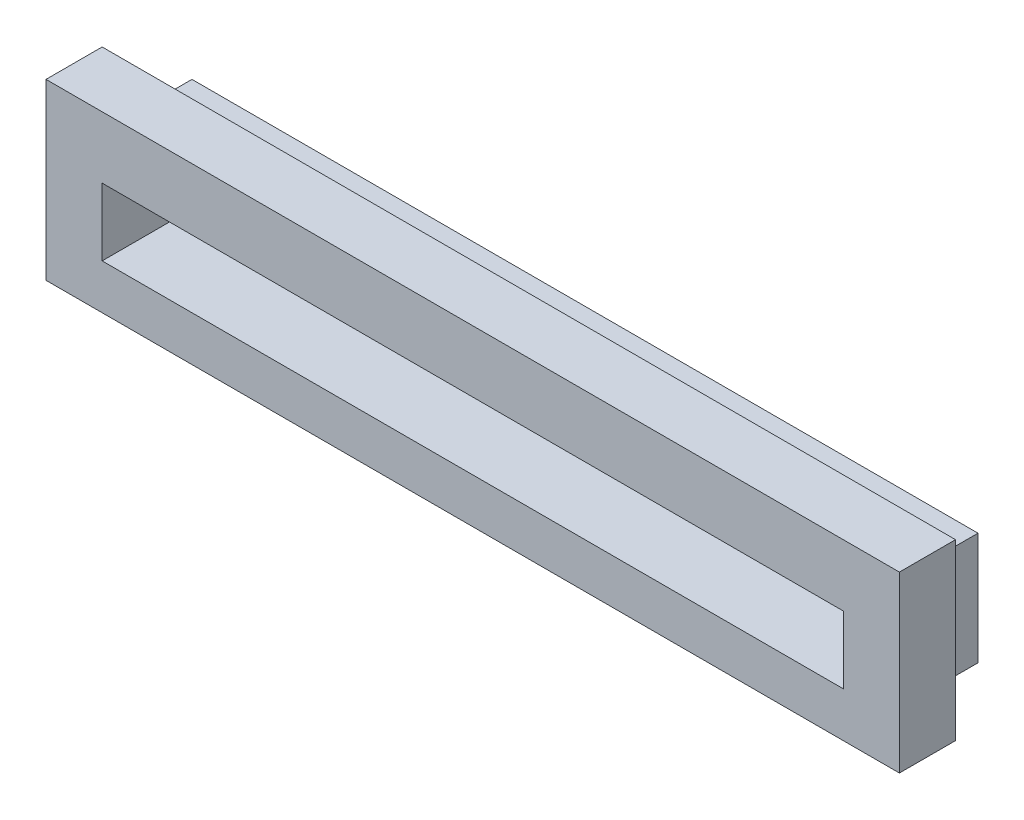
ISO-10303-21;
HEADER;
FILE_DESCRIPTION(('STEP AP214'),'2;1');
FILE_NAME('part.step','',(''),(''),'','','');
FILE_SCHEMA(('AUTOMOTIVE_DESIGN { 1 0 10303 214 1 1 1 1 }'));
ENDSEC;
DATA;
#1=APPLICATION_CONTEXT('core data for automotive mechanical design processes');
#2=APPLICATION_PROTOCOL_DEFINITION('international standard','automotive_design',2000,#1);
#3=PRODUCT_CONTEXT('',#1,'mechanical');
#4=PRODUCT('Part','Part','',(#3));
#5=PRODUCT_RELATED_PRODUCT_CATEGORY('part','',(#4));
#6=PRODUCT_DEFINITION_FORMATION('','',#4);
#7=PRODUCT_DEFINITION_CONTEXT('part definition',#1,'design');
#8=PRODUCT_DEFINITION('design','',#6,#7);
#9=PRODUCT_DEFINITION_SHAPE('','',#8);
#10=(LENGTH_UNIT() NAMED_UNIT(*) SI_UNIT(.MILLI.,.METRE.));
#11=(NAMED_UNIT(*) PLANE_ANGLE_UNIT() SI_UNIT($,.RADIAN.));
#12=(NAMED_UNIT(*) SI_UNIT($,.STERADIAN.) SOLID_ANGLE_UNIT());
#13=UNCERTAINTY_MEASURE_WITH_UNIT(LENGTH_MEASURE(1.E-05),#10,'distance_accuracy_value','');
#14=(GEOMETRIC_REPRESENTATION_CONTEXT(3) GLOBAL_UNCERTAINTY_ASSIGNED_CONTEXT((#13)) GLOBAL_UNIT_ASSIGNED_CONTEXT((#10,
#11,#12)) REPRESENTATION_CONTEXT('',''));
#15=CARTESIAN_POINT('',(0.,0.,0.));
#16=DIRECTION('',(0.,0.,1.));
#17=DIRECTION('',(1.,0.,0.));
#18=AXIS2_PLACEMENT_3D('',#15,#16,#17);
#19=CARTESIAN_POINT('',(0.,0.,25.4));
#20=DIRECTION('',(1.,0.,0.));
#21=DIRECTION('',(0.,0.,-1.));
#22=AXIS2_PLACEMENT_3D('',#19,#20,#21);
#23=PLANE('',#22);
#24=DIRECTION('',(0.,-1.,0.));
#25=VECTOR('',#24,1.);
#26=CARTESIAN_POINT('',(0.,25.4,12.7));
#27=LINE('',#26,#25);
#28=CARTESIAN_POINT('',(0.,25.4,12.7));
#29=VERTEX_POINT('',#28);
#30=CARTESIAN_POINT('',(0.,0.,12.7));
#31=VERTEX_POINT('',#30);
#32=EDGE_CURVE('E149',#29,#31,#27,.T.);
#33=ORIENTED_EDGE('',*,*,#32,.F.);
#34=DIRECTION('',(0.,0.,-1.));
#35=VECTOR('',#34,1.);
#36=CARTESIAN_POINT('',(0.,25.4,25.4));
#37=LINE('',#36,#35);
#38=CARTESIAN_POINT('',(0.,25.4,0.));
#39=VERTEX_POINT('',#38);
#40=EDGE_CURVE('E135',#29,#39,#37,.T.);
#41=ORIENTED_EDGE('',*,*,#40,.T.);
#42=DIRECTION('',(0.,-1.,0.));
#43=VECTOR('',#42,1.);
#44=CARTESIAN_POINT('',(0.,0.,0.));
#45=LINE('',#44,#43);
#46=CARTESIAN_POINT('',(0.,0.,0.));
#47=VERTEX_POINT('',#46);
#48=EDGE_CURVE('E248',#39,#47,#45,.T.);
#49=ORIENTED_EDGE('',*,*,#48,.T.);
#50=DIRECTION('',(0.,0.,-1.));
#51=VECTOR('',#50,1.);
#52=CARTESIAN_POINT('',(0.,0.,25.4));
#53=LINE('',#52,#51);
#54=EDGE_CURVE('E11',#31,#47,#53,.T.);
#55=ORIENTED_EDGE('',*,*,#54,.F.);
#56=EDGE_LOOP('',(#33,#41,#49,#55));
#57=FACE_BOUND('',#56,.T.);
#58=ADVANCED_FACE('F47',(#57),#23,.F.);
#59=CARTESIAN_POINT('',(0.,0.,25.4));
#60=DIRECTION('',(0.,1.,0.));
#61=DIRECTION('',(0.,0.,1.));
#62=AXIS2_PLACEMENT_3D('',#59,#60,#61);
#63=PLANE('',#62);
#64=DIRECTION('',(1.,0.,0.));
#65=VECTOR('',#64,1.);
#66=CARTESIAN_POINT('',(0.,0.,12.7));
#67=LINE('',#66,#65);
#68=CARTESIAN_POINT('',(177.8,0.,12.7));
#69=VERTEX_POINT('',#68);
#70=EDGE_CURVE('E61',#31,#69,#67,.T.);
#71=ORIENTED_EDGE('',*,*,#70,.F.);
#72=ORIENTED_EDGE('',*,*,#54,.T.);
#73=DIRECTION('',(1.,0.,0.));
#74=VECTOR('',#73,1.);
#75=CARTESIAN_POINT('',(0.,0.,0.));
#76=LINE('',#75,#74);
#77=CARTESIAN_POINT('',(177.8,0.,0.));
#78=VERTEX_POINT('',#77);
#79=EDGE_CURVE('E251',#47,#78,#76,.T.);
#80=ORIENTED_EDGE('',*,*,#79,.T.);
#81=DIRECTION('',(0.,0.,-1.));
#82=VECTOR('',#81,1.);
#83=CARTESIAN_POINT('',(177.8,0.,25.4));
#84=LINE('',#83,#82);
#85=EDGE_CURVE('E55',#69,#78,#84,.T.);
#86=ORIENTED_EDGE('',*,*,#85,.F.);
#87=EDGE_LOOP('',(#71,#72,#80,#86));
#88=FACE_BOUND('',#87,.T.);
#89=ADVANCED_FACE('F266',(#88),#63,.F.);
#90=CARTESIAN_POINT('',(177.8,0.,25.4));
#91=DIRECTION('',(-1.,0.,0.));
#92=DIRECTION('',(0.,0.,1.));
#93=AXIS2_PLACEMENT_3D('',#90,#91,#92);
#94=PLANE('',#93);
#95=DIRECTION('',(0.,1.,0.));
#96=VECTOR('',#95,1.);
#97=CARTESIAN_POINT('',(177.8,25.4,12.7));
#98=LINE('',#97,#96);
#99=CARTESIAN_POINT('',(177.8,25.4,12.7));
#100=VERTEX_POINT('',#99);
#101=EDGE_CURVE('E69',#69,#100,#98,.T.);
#102=ORIENTED_EDGE('',*,*,#101,.F.);
#103=ORIENTED_EDGE('',*,*,#85,.T.);
#104=DIRECTION('',(0.,1.,0.));
#105=VECTOR('',#104,1.);
#106=CARTESIAN_POINT('',(177.8,0.,0.));
#107=LINE('',#106,#105);
#108=CARTESIAN_POINT('',(177.8,25.4,0.));
#109=VERTEX_POINT('',#108);
#110=EDGE_CURVE('E255',#78,#109,#107,.T.);
#111=ORIENTED_EDGE('',*,*,#110,.T.);
#112=DIRECTION('',(0.,0.,-1.));
#113=VECTOR('',#112,1.);
#114=CARTESIAN_POINT('',(177.8,25.4,25.4));
#115=LINE('',#114,#113);
#116=EDGE_CURVE('E146',#100,#109,#115,.T.);
#117=ORIENTED_EDGE('',*,*,#116,.F.);
#118=EDGE_LOOP('',(#102,#103,#111,#117));
#119=FACE_BOUND('',#118,.T.);
#120=ADVANCED_FACE('F263',(#119),#94,.F.);
#121=CARTESIAN_POINT('',(0.,25.4,25.4));
#122=DIRECTION('',(0.,-1.,0.));
#123=DIRECTION('',(0.,0.,-1.));
#124=AXIS2_PLACEMENT_3D('',#121,#122,#123);
#125=PLANE('',#124);
#126=DIRECTION('',(-1.,0.,0.));
#127=VECTOR('',#126,1.);
#128=CARTESIAN_POINT('',(0.,25.4,12.7));
#129=LINE('',#128,#127);
#130=EDGE_CURVE('E139',#100,#29,#129,.T.);
#131=ORIENTED_EDGE('',*,*,#130,.F.);
#132=ORIENTED_EDGE('',*,*,#116,.T.);
#133=DIRECTION('',(-1.,0.,0.));
#134=VECTOR('',#133,1.);
#135=CARTESIAN_POINT('',(0.,25.4,0.));
#136=LINE('',#135,#134);
#137=EDGE_CURVE('E141',#109,#39,#136,.T.);
#138=ORIENTED_EDGE('',*,*,#137,.T.);
#139=ORIENTED_EDGE('',*,*,#40,.F.);
#140=EDGE_LOOP('',(#131,#132,#138,#139));
#141=FACE_BOUND('',#140,.T.);
#142=ADVANCED_FACE('F137',(#141),#125,.F.);
#143=CARTESIAN_POINT('',(0.,0.,25.4));
#144=DIRECTION('',(0.,0.,-1.));
#145=DIRECTION('',(-1.,0.,0.));
#146=AXIS2_PLACEMENT_3D('',#143,#144,#145);
#147=PLANE('',#146);
#148=DIRECTION('',(0.,-1.,0.));
#149=VECTOR('',#148,1.);
#150=CARTESIAN_POINT('',(5.08,20.32,25.4));
#151=LINE('',#150,#149);
#152=CARTESIAN_POINT('',(5.08,20.32,25.4));
#153=VERTEX_POINT('',#152);
#154=CARTESIAN_POINT('',(5.08,5.08,25.4));
#155=VERTEX_POINT('',#154);
#156=EDGE_CURVE('E206',#153,#155,#151,.T.);
#157=ORIENTED_EDGE('',*,*,#156,.F.);
#158=DIRECTION('',(-1.,0.,0.));
#159=VECTOR('',#158,1.);
#160=CARTESIAN_POINT('',(5.08,20.32,25.4));
#161=LINE('',#160,#159);
#162=CARTESIAN_POINT('',(172.72,20.32,25.4));
#163=VERTEX_POINT('',#162);
#164=EDGE_CURVE('E217',#163,#153,#161,.T.);
#165=ORIENTED_EDGE('',*,*,#164,.F.);
#166=DIRECTION('',(0.,1.,0.));
#167=VECTOR('',#166,1.);
#168=CARTESIAN_POINT('',(172.72,20.32,25.4));
#169=LINE('',#168,#167);
#170=CARTESIAN_POINT('',(172.72,5.08,25.4));
#171=VERTEX_POINT('',#170);
#172=EDGE_CURVE('E213',#171,#163,#169,.T.);
#173=ORIENTED_EDGE('',*,*,#172,.F.);
#174=DIRECTION('',(1.,0.,0.));
#175=VECTOR('',#174,1.);
#176=CARTESIAN_POINT('',(5.08,5.08,25.4));
#177=LINE('',#176,#175);
#178=EDGE_CURVE('E209',#155,#171,#177,.T.);
#179=ORIENTED_EDGE('',*,*,#178,.F.);
#180=EDGE_LOOP('',(#157,#165,#173,#179));
#181=FACE_BOUND('',#180,.T.);
#182=DIRECTION('',(0.,-1.,0.));
#183=VECTOR('',#182,1.);
#184=CARTESIAN_POINT('',(-7.62,34.29,25.4));
#185=LINE('',#184,#183);
#186=CARTESIAN_POINT('',(-7.62,34.29,25.4));
#187=VERTEX_POINT('',#186);
#188=CARTESIAN_POINT('',(-7.62,-5.08,25.4));
#189=VERTEX_POINT('',#188);
#190=EDGE_CURVE('E156',#187,#189,#185,.T.);
#191=ORIENTED_EDGE('',*,*,#190,.T.);
#192=DIRECTION('',(1.,0.,0.));
#193=VECTOR('',#192,1.);
#194=CARTESIAN_POINT('',(-7.62,-5.08,25.4));
#195=LINE('',#194,#193);
#196=CARTESIAN_POINT('',(185.42,-5.08,25.4));
#197=VERTEX_POINT('',#196);
#198=EDGE_CURVE('E161',#189,#197,#195,.T.);
#199=ORIENTED_EDGE('',*,*,#198,.T.);
#200=DIRECTION('',(0.,1.,0.));
#201=VECTOR('',#200,1.);
#202=CARTESIAN_POINT('',(185.42,34.29,25.4));
#203=LINE('',#202,#201);
#204=CARTESIAN_POINT('',(185.42,34.29,25.4));
#205=VERTEX_POINT('',#204);
#206=EDGE_CURVE('E187',#197,#205,#203,.T.);
#207=ORIENTED_EDGE('',*,*,#206,.T.);
#208=DIRECTION('',(-1.,0.,0.));
#209=VECTOR('',#208,1.);
#210=CARTESIAN_POINT('',(-7.62,34.29,25.4));
#211=LINE('',#210,#209);
#212=EDGE_CURVE('E171',#205,#187,#211,.T.);
#213=ORIENTED_EDGE('',*,*,#212,.T.);
#214=EDGE_LOOP('',(#191,#199,#207,#213));
#215=FACE_BOUND('',#214,.T.);
#216=ADVANCED_FACE('F272',(#181,#215),#147,.F.);
#217=CARTESIAN_POINT('',(0.,0.,0.));
#218=DIRECTION('',(0.,0.,-1.));
#219=DIRECTION('',(-1.,0.,0.));
#220=AXIS2_PLACEMENT_3D('',#217,#218,#219);
#221=PLANE('',#220);
#222=ORIENTED_EDGE('',*,*,#48,.F.);
#223=ORIENTED_EDGE('',*,*,#137,.F.);
#224=ORIENTED_EDGE('',*,*,#110,.F.);
#225=ORIENTED_EDGE('',*,*,#79,.F.);
#226=EDGE_LOOP('',(#222,#223,#224,#225));
#227=FACE_BOUND('',#226,.T.);
#228=DIRECTION('',(-1.,0.,0.));
#229=VECTOR('',#228,1.);
#230=CARTESIAN_POINT('',(5.08,20.32,0.));
#231=LINE('',#230,#229);
#232=CARTESIAN_POINT('',(172.72,20.32,0.));
#233=VERTEX_POINT('',#232);
#234=CARTESIAN_POINT('',(5.08,20.32,0.));
#235=VERTEX_POINT('',#234);
#236=EDGE_CURVE('E210',#233,#235,#231,.T.);
#237=ORIENTED_EDGE('',*,*,#236,.T.);
#238=DIRECTION('',(0.,-1.,0.));
#239=VECTOR('',#238,1.);
#240=CARTESIAN_POINT('',(5.08,20.32,0.));
#241=LINE('',#240,#239);
#242=CARTESIAN_POINT('',(5.08,5.08,0.));
#243=VERTEX_POINT('',#242);
#244=EDGE_CURVE('E197',#235,#243,#241,.T.);
#245=ORIENTED_EDGE('',*,*,#244,.T.);
#246=DIRECTION('',(1.,0.,0.));
#247=VECTOR('',#246,1.);
#248=CARTESIAN_POINT('',(5.08,5.08,0.));
#249=LINE('',#248,#247);
#250=CARTESIAN_POINT('',(172.72,5.08,0.));
#251=VERTEX_POINT('',#250);
#252=EDGE_CURVE('E224',#243,#251,#249,.T.);
#253=ORIENTED_EDGE('',*,*,#252,.T.);
#254=DIRECTION('',(0.,1.,0.));
#255=VECTOR('',#254,1.);
#256=CARTESIAN_POINT('',(172.72,20.32,0.));
#257=LINE('',#256,#255);
#258=EDGE_CURVE('E228',#251,#233,#257,.T.);
#259=ORIENTED_EDGE('',*,*,#258,.T.);
#260=EDGE_LOOP('',(#237,#245,#253,#259));
#261=FACE_BOUND('',#260,.T.);
#262=ADVANCED_FACE('F268',(#227,#261),#221,.T.);
#263=CARTESIAN_POINT('',(5.08,20.32,25.4));
#264=DIRECTION('',(1.,0.,0.));
#265=DIRECTION('',(0.,1.,0.));
#266=AXIS2_PLACEMENT_3D('',#263,#264,#265);
#267=PLANE('',#266);
#268=ORIENTED_EDGE('',*,*,#244,.F.);
#269=DIRECTION('',(0.,0.,-1.));
#270=VECTOR('',#269,1.);
#271=CARTESIAN_POINT('',(5.08,20.32,25.4));
#272=LINE('',#271,#270);
#273=EDGE_CURVE('E220',#153,#235,#272,.T.);
#274=ORIENTED_EDGE('',*,*,#273,.F.);
#275=ORIENTED_EDGE('',*,*,#156,.T.);
#276=DIRECTION('',(0.,0.,-1.));
#277=VECTOR('',#276,1.);
#278=CARTESIAN_POINT('',(5.08,5.08,25.4));
#279=LINE('',#278,#277);
#280=EDGE_CURVE('E244',#155,#243,#279,.T.);
#281=ORIENTED_EDGE('',*,*,#280,.T.);
#282=EDGE_LOOP('',(#268,#274,#275,#281));
#283=FACE_BOUND('',#282,.T.);
#284=ADVANCED_FACE('F271',(#283),#267,.T.);
#285=CARTESIAN_POINT('',(5.08,5.08,25.4));
#286=DIRECTION('',(0.,1.,0.));
#287=DIRECTION('',(0.,0.,1.));
#288=AXIS2_PLACEMENT_3D('',#285,#286,#287);
#289=PLANE('',#288);
#290=ORIENTED_EDGE('',*,*,#252,.F.);
#291=ORIENTED_EDGE('',*,*,#280,.F.);
#292=ORIENTED_EDGE('',*,*,#178,.T.);
#293=DIRECTION('',(0.,0.,-1.));
#294=VECTOR('',#293,1.);
#295=CARTESIAN_POINT('',(172.72,5.08,25.4));
#296=LINE('',#295,#294);
#297=EDGE_CURVE('E241',#171,#251,#296,.T.);
#298=ORIENTED_EDGE('',*,*,#297,.T.);
#299=EDGE_LOOP('',(#290,#291,#292,#298));
#300=FACE_BOUND('',#299,.T.);
#301=ADVANCED_FACE('F289',(#300),#289,.T.);
#302=CARTESIAN_POINT('',(172.72,20.32,25.4));
#303=DIRECTION('',(-1.,0.,0.));
#304=DIRECTION('',(0.,0.,1.));
#305=AXIS2_PLACEMENT_3D('',#302,#303,#304);
#306=PLANE('',#305);
#307=ORIENTED_EDGE('',*,*,#258,.F.);
#308=ORIENTED_EDGE('',*,*,#297,.F.);
#309=ORIENTED_EDGE('',*,*,#172,.T.);
#310=DIRECTION('',(0.,0.,-1.));
#311=VECTOR('',#310,1.);
#312=CARTESIAN_POINT('',(172.72,20.32,25.4));
#313=LINE('',#312,#311);
#314=EDGE_CURVE('E238',#163,#233,#313,.T.);
#315=ORIENTED_EDGE('',*,*,#314,.T.);
#316=EDGE_LOOP('',(#307,#308,#309,#315));
#317=FACE_BOUND('',#316,.T.);
#318=ADVANCED_FACE('F291',(#317),#306,.T.);
#319=CARTESIAN_POINT('',(5.08,20.32,25.4));
#320=DIRECTION('',(0.,-1.,0.));
#321=DIRECTION('',(0.,0.,-1.));
#322=AXIS2_PLACEMENT_3D('',#319,#320,#321);
#323=PLANE('',#322);
#324=ORIENTED_EDGE('',*,*,#236,.F.);
#325=ORIENTED_EDGE('',*,*,#314,.F.);
#326=ORIENTED_EDGE('',*,*,#164,.T.);
#327=ORIENTED_EDGE('',*,*,#273,.T.);
#328=EDGE_LOOP('',(#324,#325,#326,#327));
#329=FACE_BOUND('',#328,.T.);
#330=ADVANCED_FACE('F277',(#329),#323,.T.);
#331=CARTESIAN_POINT('',(-7.62,34.29,12.7));
#332=DIRECTION('',(-1.,0.,0.));
#333=DIRECTION('',(0.,-1.,0.));
#334=AXIS2_PLACEMENT_3D('',#331,#332,#333);
#335=PLANE('',#334);
#336=ORIENTED_EDGE('',*,*,#190,.F.);
#337=DIRECTION('',(0.,0.,1.));
#338=VECTOR('',#337,1.);
#339=CARTESIAN_POINT('',(-7.62,34.29,12.7));
#340=LINE('',#339,#338);
#341=CARTESIAN_POINT('',(-7.62,34.29,12.7));
#342=VERTEX_POINT('',#341);
#343=EDGE_CURVE('E194',#342,#187,#340,.T.);
#344=ORIENTED_EDGE('',*,*,#343,.F.);
#345=DIRECTION('',(0.,-1.,0.));
#346=VECTOR('',#345,1.);
#347=CARTESIAN_POINT('',(-7.62,34.29,12.7));
#348=LINE('',#347,#346);
#349=CARTESIAN_POINT('',(-7.62,-5.08,12.7));
#350=VERTEX_POINT('',#349);
#351=EDGE_CURVE('E166',#342,#350,#348,.T.);
#352=ORIENTED_EDGE('',*,*,#351,.T.);
#353=DIRECTION('',(0.,0.,1.));
#354=VECTOR('',#353,1.);
#355=CARTESIAN_POINT('',(-7.62,-5.08,12.7));
#356=LINE('',#355,#354);
#357=EDGE_CURVE('E182',#350,#189,#356,.T.);
#358=ORIENTED_EDGE('',*,*,#357,.T.);
#359=EDGE_LOOP('',(#336,#344,#352,#358));
#360=FACE_BOUND('',#359,.T.);
#361=ADVANCED_FACE('F298',(#360),#335,.T.);
#362=CARTESIAN_POINT('',(-7.62,34.29,12.7));
#363=DIRECTION('',(0.,1.,0.));
#364=DIRECTION('',(0.,0.,1.));
#365=AXIS2_PLACEMENT_3D('',#362,#363,#364);
#366=PLANE('',#365);
#367=ORIENTED_EDGE('',*,*,#212,.F.);
#368=DIRECTION('',(0.,0.,1.));
#369=VECTOR('',#368,1.);
#370=CARTESIAN_POINT('',(185.42,34.29,12.7));
#371=LINE('',#370,#369);
#372=CARTESIAN_POINT('',(185.42,34.29,12.7));
#373=VERTEX_POINT('',#372);
#374=EDGE_CURVE('E198',#373,#205,#371,.T.);
#375=ORIENTED_EDGE('',*,*,#374,.F.);
#376=DIRECTION('',(-1.,0.,0.));
#377=VECTOR('',#376,1.);
#378=CARTESIAN_POINT('',(-7.62,34.29,12.7));
#379=LINE('',#378,#377);
#380=EDGE_CURVE('E179',#373,#342,#379,.T.);
#381=ORIENTED_EDGE('',*,*,#380,.T.);
#382=ORIENTED_EDGE('',*,*,#343,.T.);
#383=EDGE_LOOP('',(#367,#375,#381,#382));
#384=FACE_BOUND('',#383,.T.);
#385=ADVANCED_FACE('F370',(#384),#366,.T.);
#386=CARTESIAN_POINT('',(185.42,34.29,12.7));
#387=DIRECTION('',(1.,0.,0.));
#388=DIRECTION('',(0.,0.,-1.));
#389=AXIS2_PLACEMENT_3D('',#386,#387,#388);
#390=PLANE('',#389);
#391=ORIENTED_EDGE('',*,*,#206,.F.);
#392=DIRECTION('',(0.,0.,1.));
#393=VECTOR('',#392,1.);
#394=CARTESIAN_POINT('',(185.42,-5.08,12.7));
#395=LINE('',#394,#393);
#396=CARTESIAN_POINT('',(185.42,-5.08,12.7));
#397=VERTEX_POINT('',#396);
#398=EDGE_CURVE('E201',#397,#197,#395,.T.);
#399=ORIENTED_EDGE('',*,*,#398,.F.);
#400=DIRECTION('',(0.,1.,0.));
#401=VECTOR('',#400,1.);
#402=CARTESIAN_POINT('',(185.42,34.29,12.7));
#403=LINE('',#402,#401);
#404=EDGE_CURVE('E175',#397,#373,#403,.T.);
#405=ORIENTED_EDGE('',*,*,#404,.T.);
#406=ORIENTED_EDGE('',*,*,#374,.T.);
#407=EDGE_LOOP('',(#391,#399,#405,#406));
#408=FACE_BOUND('',#407,.T.);
#409=ADVANCED_FACE('F380',(#408),#390,.T.);
#410=CARTESIAN_POINT('',(-7.62,-5.08,12.7));
#411=DIRECTION('',(0.,-1.,0.));
#412=DIRECTION('',(0.,0.,-1.));
#413=AXIS2_PLACEMENT_3D('',#410,#411,#412);
#414=PLANE('',#413);
#415=ORIENTED_EDGE('',*,*,#198,.F.);
#416=ORIENTED_EDGE('',*,*,#357,.F.);
#417=DIRECTION('',(1.,0.,0.));
#418=VECTOR('',#417,1.);
#419=CARTESIAN_POINT('',(-7.62,-5.08,12.7));
#420=LINE('',#419,#418);
#421=EDGE_CURVE('E170',#350,#397,#420,.T.);
#422=ORIENTED_EDGE('',*,*,#421,.T.);
#423=ORIENTED_EDGE('',*,*,#398,.T.);
#424=EDGE_LOOP('',(#415,#416,#422,#423));
#425=FACE_BOUND('',#424,.T.);
#426=ADVANCED_FACE('F390',(#425),#414,.T.);
#427=CARTESIAN_POINT('',(0.,0.,12.7));
#428=DIRECTION('',(0.,0.,1.));
#429=DIRECTION('',(1.,0.,0.));
#430=AXIS2_PLACEMENT_3D('',#427,#428,#429);
#431=PLANE('',#430);
#432=ORIENTED_EDGE('',*,*,#130,.T.);
#433=ORIENTED_EDGE('',*,*,#32,.T.);
#434=ORIENTED_EDGE('',*,*,#70,.T.);
#435=ORIENTED_EDGE('',*,*,#101,.T.);
#436=EDGE_LOOP('',(#432,#433,#434,#435));
#437=FACE_BOUND('',#436,.T.);
#438=ORIENTED_EDGE('',*,*,#351,.F.);
#439=ORIENTED_EDGE('',*,*,#380,.F.);
#440=ORIENTED_EDGE('',*,*,#404,.F.);
#441=ORIENTED_EDGE('',*,*,#421,.F.);
#442=EDGE_LOOP('',(#438,#439,#440,#441));
#443=FACE_BOUND('',#442,.T.);
#444=ADVANCED_FACE('F153',(#437,#443),#431,.F.);
#445=CLOSED_SHELL('',(#58,#89,#120,#142,#216,#262,#284,#301,#318,#330,#361,#385,#409,#426,#444));
#446=MANIFOLD_SOLID_BREP('B2',#445);
#447=ADVANCED_BREP_SHAPE_REPRESENTATION('',(#18,#446),#14);
#448=SHAPE_DEFINITION_REPRESENTATION(#9,#447);
ENDSEC;
END-ISO-10303-21;
